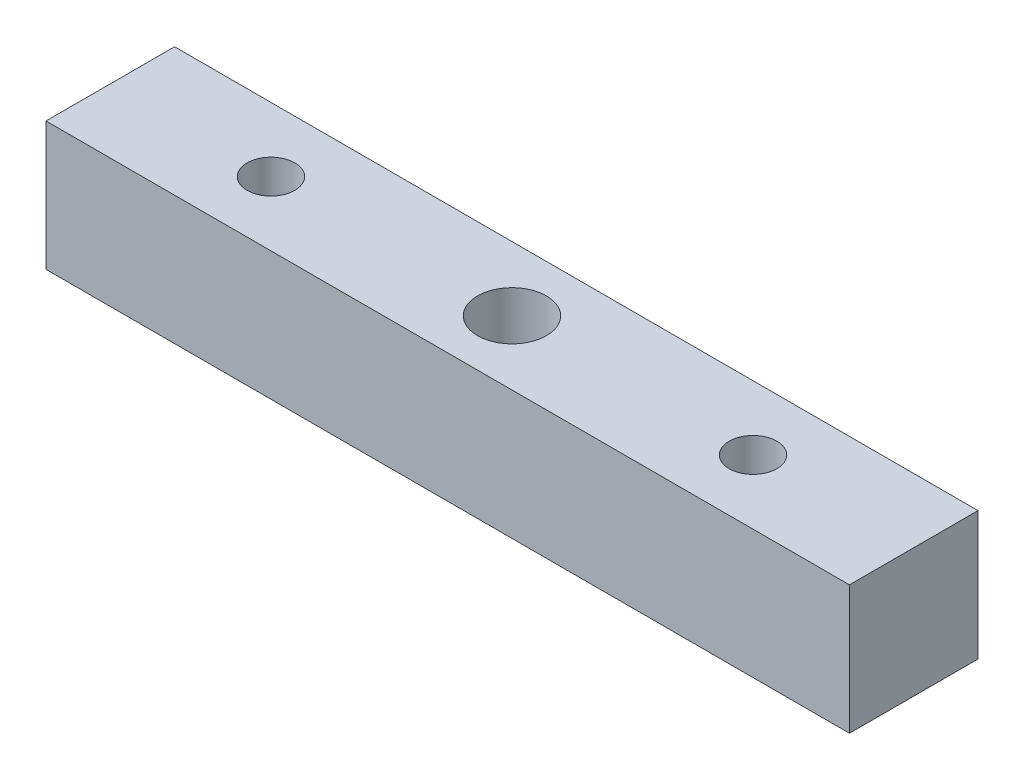
ISO-10303-21;
HEADER;
FILE_DESCRIPTION(('STEP AP214'),'2;1');
FILE_NAME('part.step','',(''),(''),'','','');
FILE_SCHEMA(('AUTOMOTIVE_DESIGN { 1 0 10303 214 1 1 1 1 }'));
ENDSEC;
DATA;
#1=APPLICATION_CONTEXT('core data for automotive mechanical design processes');
#2=APPLICATION_PROTOCOL_DEFINITION('international standard','automotive_design',2000,#1);
#3=PRODUCT_CONTEXT('',#1,'mechanical');
#4=PRODUCT('Part','Part','',(#3));
#5=PRODUCT_RELATED_PRODUCT_CATEGORY('part','',(#4));
#6=PRODUCT_DEFINITION_FORMATION('','',#4);
#7=PRODUCT_DEFINITION_CONTEXT('part definition',#1,'design');
#8=PRODUCT_DEFINITION('design','',#6,#7);
#9=PRODUCT_DEFINITION_SHAPE('','',#8);
#10=(LENGTH_UNIT() NAMED_UNIT(*) SI_UNIT(.MILLI.,.METRE.));
#11=(NAMED_UNIT(*) PLANE_ANGLE_UNIT() SI_UNIT($,.RADIAN.));
#12=(NAMED_UNIT(*) SI_UNIT($,.STERADIAN.) SOLID_ANGLE_UNIT());
#13=UNCERTAINTY_MEASURE_WITH_UNIT(LENGTH_MEASURE(1.E-05),#10,'distance_accuracy_value','');
#14=(GEOMETRIC_REPRESENTATION_CONTEXT(3) GLOBAL_UNCERTAINTY_ASSIGNED_CONTEXT((#13)) GLOBAL_UNIT_ASSIGNED_CONTEXT((#10,
#11,#12)) REPRESENTATION_CONTEXT('',''));
#15=CARTESIAN_POINT('',(0.,0.,0.));
#16=DIRECTION('',(0.,0.,1.));
#17=DIRECTION('',(1.,0.,0.));
#18=AXIS2_PLACEMENT_3D('',#15,#16,#17);
#19=CARTESIAN_POINT('',(25.,8.,-4.));
#20=DIRECTION('',(-1.,0.,0.));
#21=DIRECTION('',(0.,0.,1.));
#22=AXIS2_PLACEMENT_3D('',#19,#20,#21);
#23=PLANE('',#22);
#24=DIRECTION('',(0.,0.,-1.));
#25=VECTOR('',#24,1.);
#26=CARTESIAN_POINT('',(25.,0.,-4.));
#27=LINE('',#26,#25);
#28=CARTESIAN_POINT('',(25.,0.,4.));
#29=VERTEX_POINT('',#28);
#30=CARTESIAN_POINT('',(25.,0.,-4.));
#31=VERTEX_POINT('',#30);
#32=EDGE_CURVE('E113',#29,#31,#27,.T.);
#33=ORIENTED_EDGE('',*,*,#32,.T.);
#34=DIRECTION('',(0.,-1.,0.));
#35=VECTOR('',#34,1.);
#36=CARTESIAN_POINT('',(25.,8.,-4.));
#37=LINE('',#36,#35);
#38=CARTESIAN_POINT('',(25.,8.,-4.));
#39=VERTEX_POINT('',#38);
#40=EDGE_CURVE('E11',#39,#31,#37,.T.);
#41=ORIENTED_EDGE('',*,*,#40,.F.);
#42=DIRECTION('',(0.,0.,-1.));
#43=VECTOR('',#42,1.);
#44=CARTESIAN_POINT('',(25.,8.,-4.));
#45=LINE('',#44,#43);
#46=CARTESIAN_POINT('',(25.,8.,4.));
#47=VERTEX_POINT('',#46);
#48=EDGE_CURVE('E97',#47,#39,#45,.T.);
#49=ORIENTED_EDGE('',*,*,#48,.F.);
#50=DIRECTION('',(0.,-1.,0.));
#51=VECTOR('',#50,1.);
#52=CARTESIAN_POINT('',(25.,8.,4.));
#53=LINE('',#52,#51);
#54=EDGE_CURVE('E109',#47,#29,#53,.T.);
#55=ORIENTED_EDGE('',*,*,#54,.T.);
#56=EDGE_LOOP('',(#33,#41,#49,#55));
#57=FACE_BOUND('',#56,.T.);
#58=ADVANCED_FACE('F45',(#57),#23,.F.);
#59=CARTESIAN_POINT('',(-25.,8.,-4.));
#60=DIRECTION('',(0.,0.,1.));
#61=DIRECTION('',(1.,0.,0.));
#62=AXIS2_PLACEMENT_3D('',#59,#60,#61);
#63=PLANE('',#62);
#64=DIRECTION('',(-1.,0.,0.));
#65=VECTOR('',#64,1.);
#66=CARTESIAN_POINT('',(-25.,0.,-4.));
#67=LINE('',#66,#65);
#68=CARTESIAN_POINT('',(-25.,0.,-4.));
#69=VERTEX_POINT('',#68);
#70=EDGE_CURVE('E102',#31,#69,#67,.T.);
#71=ORIENTED_EDGE('',*,*,#70,.T.);
#72=DIRECTION('',(0.,-1.,0.));
#73=VECTOR('',#72,1.);
#74=CARTESIAN_POINT('',(-25.,8.,-4.));
#75=LINE('',#74,#73);
#76=CARTESIAN_POINT('',(-25.,8.,-4.));
#77=VERTEX_POINT('',#76);
#78=EDGE_CURVE('E54',#77,#69,#75,.T.);
#79=ORIENTED_EDGE('',*,*,#78,.F.);
#80=DIRECTION('',(-1.,0.,0.));
#81=VECTOR('',#80,1.);
#82=CARTESIAN_POINT('',(-25.,8.,-4.));
#83=LINE('',#82,#81);
#84=EDGE_CURVE('E92',#39,#77,#83,.T.);
#85=ORIENTED_EDGE('',*,*,#84,.F.);
#86=ORIENTED_EDGE('',*,*,#40,.T.);
#87=EDGE_LOOP('',(#71,#79,#85,#86));
#88=FACE_BOUND('',#87,.T.);
#89=ADVANCED_FACE('F101',(#88),#63,.F.);
#90=CARTESIAN_POINT('',(-25.,8.,-4.));
#91=DIRECTION('',(1.,0.,0.));
#92=DIRECTION('',(0.,0.,-1.));
#93=AXIS2_PLACEMENT_3D('',#90,#91,#92);
#94=PLANE('',#93);
#95=DIRECTION('',(0.,0.,1.));
#96=VECTOR('',#95,1.);
#97=CARTESIAN_POINT('',(-25.,0.,-4.));
#98=LINE('',#97,#96);
#99=CARTESIAN_POINT('',(-25.,0.,4.));
#100=VERTEX_POINT('',#99);
#101=EDGE_CURVE('E79',#69,#100,#98,.T.);
#102=ORIENTED_EDGE('',*,*,#101,.T.);
#103=DIRECTION('',(0.,-1.,0.));
#104=VECTOR('',#103,1.);
#105=CARTESIAN_POINT('',(-25.,8.,4.));
#106=LINE('',#105,#104);
#107=CARTESIAN_POINT('',(-25.,8.,4.));
#108=VERTEX_POINT('',#107);
#109=EDGE_CURVE('E104',#108,#100,#106,.T.);
#110=ORIENTED_EDGE('',*,*,#109,.F.);
#111=DIRECTION('',(0.,0.,1.));
#112=VECTOR('',#111,1.);
#113=CARTESIAN_POINT('',(-25.,8.,-4.));
#114=LINE('',#113,#112);
#115=EDGE_CURVE('E95',#77,#108,#114,.T.);
#116=ORIENTED_EDGE('',*,*,#115,.F.);
#117=ORIENTED_EDGE('',*,*,#78,.T.);
#118=EDGE_LOOP('',(#102,#110,#116,#117));
#119=FACE_BOUND('',#118,.T.);
#120=ADVANCED_FACE('F105',(#119),#94,.F.);
#121=CARTESIAN_POINT('',(-25.,8.,4.));
#122=DIRECTION('',(0.,0.,-1.));
#123=DIRECTION('',(-1.,0.,0.));
#124=AXIS2_PLACEMENT_3D('',#121,#122,#123);
#125=PLANE('',#124);
#126=DIRECTION('',(1.,0.,0.));
#127=VECTOR('',#126,1.);
#128=CARTESIAN_POINT('',(-25.,0.,4.));
#129=LINE('',#128,#127);
#130=EDGE_CURVE('E85',#100,#29,#129,.T.);
#131=ORIENTED_EDGE('',*,*,#130,.T.);
#132=ORIENTED_EDGE('',*,*,#54,.F.);
#133=DIRECTION('',(1.,0.,0.));
#134=VECTOR('',#133,1.);
#135=CARTESIAN_POINT('',(-25.,8.,4.));
#136=LINE('',#135,#134);
#137=EDGE_CURVE('E62',#108,#47,#136,.T.);
#138=ORIENTED_EDGE('',*,*,#137,.F.);
#139=ORIENTED_EDGE('',*,*,#109,.T.);
#140=EDGE_LOOP('',(#131,#132,#138,#139));
#141=FACE_BOUND('',#140,.T.);
#142=ADVANCED_FACE('F127',(#141),#125,.F.);
#143=CARTESIAN_POINT('',(0.,8.,0.));
#144=DIRECTION('',(0.,1.,0.));
#145=DIRECTION('',(0.,0.,1.));
#146=AXIS2_PLACEMENT_3D('',#143,#144,#145);
#147=PLANE('',#146);
#148=CARTESIAN_POINT('',(15.,8.,0.));
#149=DIRECTION('',(0.,1.,0.));
#150=DIRECTION('',(0.,0.,1.));
#151=AXIS2_PLACEMENT_3D('',#148,#149,#150);
#152=CIRCLE('',#151,1.485);
#153=CARTESIAN_POINT('',(15.,8.,1.485));
#154=VERTEX_POINT('',#153);
#155=EDGE_CURVE('E146',#154,#154,#152,.T.);
#156=ORIENTED_EDGE('',*,*,#155,.F.);
#157=EDGE_LOOP('',(#156));
#158=FACE_BOUND('',#157,.T.);
#159=CARTESIAN_POINT('',(-15.,8.,0.));
#160=DIRECTION('',(0.,1.,0.));
#161=DIRECTION('',(0.,0.,1.));
#162=AXIS2_PLACEMENT_3D('',#159,#160,#161);
#163=CIRCLE('',#162,1.485);
#164=CARTESIAN_POINT('',(-15.,8.,1.485));
#165=VERTEX_POINT('',#164);
#166=EDGE_CURVE('E138',#165,#165,#163,.T.);
#167=ORIENTED_EDGE('',*,*,#166,.F.);
#168=EDGE_LOOP('',(#167));
#169=FACE_BOUND('',#168,.T.);
#170=CARTESIAN_POINT('',(0.,8.,0.));
#171=DIRECTION('',(0.,1.,0.));
#172=DIRECTION('',(0.,0.,1.));
#173=AXIS2_PLACEMENT_3D('',#170,#171,#172);
#174=CIRCLE('',#173,2.145);
#175=CARTESIAN_POINT('',(0.,8.,2.145));
#176=VERTEX_POINT('',#175);
#177=EDGE_CURVE('E134',#176,#176,#174,.T.);
#178=ORIENTED_EDGE('',*,*,#177,.F.);
#179=EDGE_LOOP('',(#178));
#180=FACE_BOUND('',#179,.T.);
#181=ORIENTED_EDGE('',*,*,#48,.T.);
#182=ORIENTED_EDGE('',*,*,#84,.T.);
#183=ORIENTED_EDGE('',*,*,#115,.T.);
#184=ORIENTED_EDGE('',*,*,#137,.T.);
#185=EDGE_LOOP('',(#181,#182,#183,#184));
#186=FACE_BOUND('',#185,.T.);
#187=ADVANCED_FACE('F93',(#158,#169,#180,#186),#147,.T.);
#188=CARTESIAN_POINT('',(0.,0.,0.));
#189=DIRECTION('',(0.,1.,0.));
#190=DIRECTION('',(0.,0.,1.));
#191=AXIS2_PLACEMENT_3D('',#188,#189,#190);
#192=PLANE('',#191);
#193=CARTESIAN_POINT('',(15.,0.,0.));
#194=DIRECTION('',(0.,1.,0.));
#195=DIRECTION('',(0.,0.,1.));
#196=AXIS2_PLACEMENT_3D('',#193,#194,#195);
#197=CIRCLE('',#196,1.485);
#198=CARTESIAN_POINT('',(15.,0.,1.485));
#199=VERTEX_POINT('',#198);
#200=EDGE_CURVE('E142',#199,#199,#197,.T.);
#201=ORIENTED_EDGE('',*,*,#200,.T.);
#202=EDGE_LOOP('',(#201));
#203=FACE_BOUND('',#202,.T.);
#204=CARTESIAN_POINT('',(-15.,0.,0.));
#205=DIRECTION('',(0.,1.,0.));
#206=DIRECTION('',(0.,0.,1.));
#207=AXIS2_PLACEMENT_3D('',#204,#205,#206);
#208=CIRCLE('',#207,1.485);
#209=CARTESIAN_POINT('',(-15.,0.,1.485));
#210=VERTEX_POINT('',#209);
#211=EDGE_CURVE('E150',#210,#210,#208,.T.);
#212=ORIENTED_EDGE('',*,*,#211,.T.);
#213=EDGE_LOOP('',(#212));
#214=FACE_BOUND('',#213,.T.);
#215=CARTESIAN_POINT('',(0.,0.,0.));
#216=DIRECTION('',(0.,1.,0.));
#217=DIRECTION('',(0.,0.,1.));
#218=AXIS2_PLACEMENT_3D('',#215,#216,#217);
#219=CIRCLE('',#218,2.145);
#220=CARTESIAN_POINT('',(0.,0.,2.145));
#221=VERTEX_POINT('',#220);
#222=EDGE_CURVE('E117',#221,#221,#219,.T.);
#223=ORIENTED_EDGE('',*,*,#222,.T.);
#224=EDGE_LOOP('',(#223));
#225=FACE_BOUND('',#224,.T.);
#226=ORIENTED_EDGE('',*,*,#32,.F.);
#227=ORIENTED_EDGE('',*,*,#130,.F.);
#228=ORIENTED_EDGE('',*,*,#101,.F.);
#229=ORIENTED_EDGE('',*,*,#70,.F.);
#230=EDGE_LOOP('',(#226,#227,#228,#229));
#231=FACE_BOUND('',#230,.T.);
#232=ADVANCED_FACE('F130',(#203,#214,#225,#231),#192,.F.);
#233=CARTESIAN_POINT('',(0.,0.,0.));
#234=DIRECTION('',(0.,1.,0.));
#235=DIRECTION('',(0.,0.,1.));
#236=AXIS2_PLACEMENT_3D('',#233,#234,#235);
#237=CYLINDRICAL_SURFACE('',#236,2.145);
#238=ORIENTED_EDGE('',*,*,#222,.F.);
#239=EDGE_LOOP('',(#238));
#240=FACE_BOUND('',#239,.T.);
#241=ORIENTED_EDGE('',*,*,#177,.T.);
#242=EDGE_LOOP('',(#241));
#243=FACE_BOUND('',#242,.T.);
#244=ADVANCED_FACE('F166',(#240,#243),#237,.F.);
#245=CARTESIAN_POINT('',(-15.,0.,0.));
#246=DIRECTION('',(0.,1.,0.));
#247=DIRECTION('',(0.,0.,1.));
#248=AXIS2_PLACEMENT_3D('',#245,#246,#247);
#249=CYLINDRICAL_SURFACE('',#248,1.485);
#250=ORIENTED_EDGE('',*,*,#211,.F.);
#251=EDGE_LOOP('',(#250));
#252=FACE_BOUND('',#251,.T.);
#253=ORIENTED_EDGE('',*,*,#166,.T.);
#254=EDGE_LOOP('',(#253));
#255=FACE_BOUND('',#254,.T.);
#256=ADVANCED_FACE('F158',(#252,#255),#249,.F.);
#257=CARTESIAN_POINT('',(15.,0.,0.));
#258=DIRECTION('',(0.,1.,0.));
#259=DIRECTION('',(0.,0.,1.));
#260=AXIS2_PLACEMENT_3D('',#257,#258,#259);
#261=CYLINDRICAL_SURFACE('',#260,1.485);
#262=ORIENTED_EDGE('',*,*,#200,.F.);
#263=EDGE_LOOP('',(#262));
#264=FACE_BOUND('',#263,.T.);
#265=ORIENTED_EDGE('',*,*,#155,.T.);
#266=EDGE_LOOP('',(#265));
#267=FACE_BOUND('',#266,.T.);
#268=ADVANCED_FACE('F174',(#264,#267),#261,.F.);
#269=CLOSED_SHELL('',(#58,#89,#120,#142,#187,#232,#244,#256,#268));
#270=MANIFOLD_SOLID_BREP('B2',#269);
#271=ADVANCED_BREP_SHAPE_REPRESENTATION('',(#18,#270),#14);
#272=SHAPE_DEFINITION_REPRESENTATION(#9,#271);
ENDSEC;
END-ISO-10303-21;
